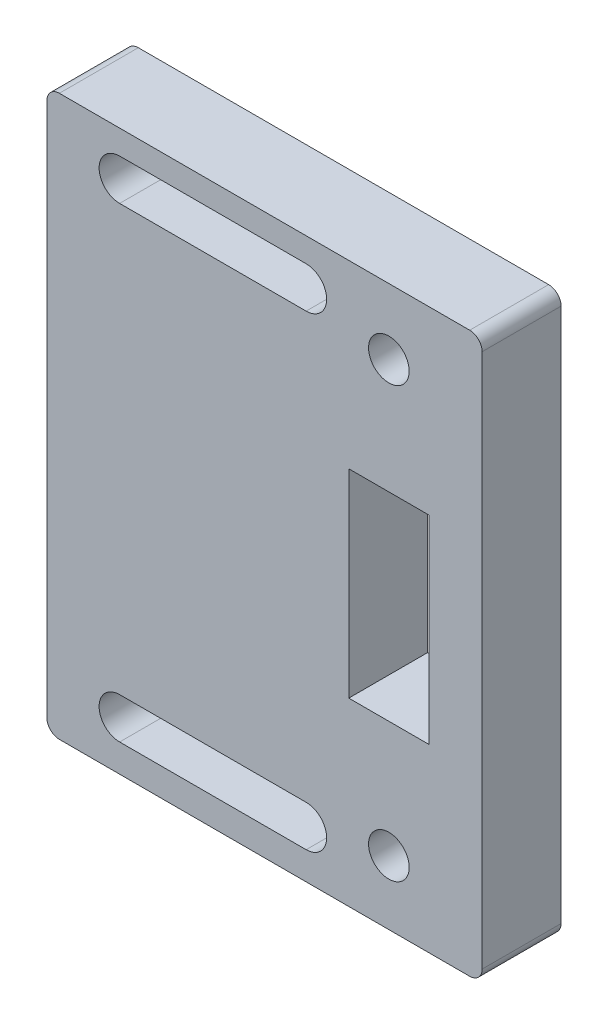
ISO-10303-21;
HEADER;
FILE_DESCRIPTION(('STEP AP214'),'2;1');
FILE_NAME('part.step','',(''),(''),'','','');
FILE_SCHEMA(('AUTOMOTIVE_DESIGN { 1 0 10303 214 1 1 1 1 }'));
ENDSEC;
DATA;
#1=APPLICATION_CONTEXT('core data for automotive mechanical design processes');
#2=APPLICATION_PROTOCOL_DEFINITION('international standard','automotive_design',2000,#1);
#3=PRODUCT_CONTEXT('',#1,'mechanical');
#4=PRODUCT('Part','Part','',(#3));
#5=PRODUCT_RELATED_PRODUCT_CATEGORY('part','',(#4));
#6=PRODUCT_DEFINITION_FORMATION('','',#4);
#7=PRODUCT_DEFINITION_CONTEXT('part definition',#1,'design');
#8=PRODUCT_DEFINITION('design','',#6,#7);
#9=PRODUCT_DEFINITION_SHAPE('','',#8);
#10=(LENGTH_UNIT() NAMED_UNIT(*) SI_UNIT(.MILLI.,.METRE.));
#11=(NAMED_UNIT(*) PLANE_ANGLE_UNIT() SI_UNIT($,.RADIAN.));
#12=(NAMED_UNIT(*) SI_UNIT($,.STERADIAN.) SOLID_ANGLE_UNIT());
#13=UNCERTAINTY_MEASURE_WITH_UNIT(LENGTH_MEASURE(1.E-05),#10,'distance_accuracy_value','');
#14=(GEOMETRIC_REPRESENTATION_CONTEXT(3) GLOBAL_UNCERTAINTY_ASSIGNED_CONTEXT((#13)) GLOBAL_UNIT_ASSIGNED_CONTEXT((#10,
#11,#12)) REPRESENTATION_CONTEXT('',''));
#15=CARTESIAN_POINT('',(0.,0.,0.));
#16=DIRECTION('',(0.,0.,1.));
#17=DIRECTION('',(1.,0.,0.));
#18=AXIS2_PLACEMENT_3D('',#15,#16,#17);
#19=CARTESIAN_POINT('',(0.,0.,12.7));
#20=DIRECTION('',(0.,0.,1.));
#21=DIRECTION('',(1.,0.,0.));
#22=AXIS2_PLACEMENT_3D('',#19,#20,#21);
#23=PLANE('',#22);
#24=DIRECTION('',(1.,0.,0.));
#25=VECTOR('',#24,1.);
#26=CARTESIAN_POINT('',(11.6955278418537,-78.9133841190442,12.7));
#27=LINE('',#26,#25);
#28=CARTESIAN_POINT('',(11.6955278418537,-78.9133841190442,12.7));
#29=VERTEX_POINT('',#28);
#30=CARTESIAN_POINT('',(41.6955278418537,-78.9133841190441,12.7));
#31=VERTEX_POINT('',#30);
#32=EDGE_CURVE('E182',#29,#31,#27,.T.);
#33=ORIENTED_EDGE('',*,*,#32,.T.);
#34=CARTESIAN_POINT('',(41.6955278418537,-82.2133841190441,12.7));
#35=DIRECTION('',(0.,0.,-1.));
#36=DIRECTION('',(-1.,0.,0.));
#37=AXIS2_PLACEMENT_3D('',#34,#35,#36);
#38=CIRCLE('',#37,3.3);
#39=CARTESIAN_POINT('',(41.6955278418537,-85.5133841190441,12.7));
#40=VERTEX_POINT('',#39);
#41=EDGE_CURVE('E194',#31,#40,#38,.T.);
#42=ORIENTED_EDGE('',*,*,#41,.T.);
#43=DIRECTION('',(-1.,0.,0.));
#44=VECTOR('',#43,1.);
#45=CARTESIAN_POINT('',(41.6955278418537,-85.5133841190441,12.7));
#46=LINE('',#45,#44);
#47=CARTESIAN_POINT('',(11.6955278418537,-85.5133841190441,12.7));
#48=VERTEX_POINT('',#47);
#49=EDGE_CURVE('E55',#40,#48,#46,.T.);
#50=ORIENTED_EDGE('',*,*,#49,.T.);
#51=CARTESIAN_POINT('',(11.6955278418537,-82.2133841190442,12.7));
#52=DIRECTION('',(0.,0.,-1.));
#53=DIRECTION('',(-1.,0.,0.));
#54=AXIS2_PLACEMENT_3D('',#51,#52,#53);
#55=CIRCLE('',#54,3.29999999999998);
#56=EDGE_CURVE('E191',#48,#29,#55,.T.);
#57=ORIENTED_EDGE('',*,*,#56,.T.);
#58=EDGE_LOOP('',(#33,#42,#50,#57));
#59=FACE_BOUND('',#58,.T.);
#60=DIRECTION('',(1.,0.,0.));
#61=VECTOR('',#60,1.);
#62=CARTESIAN_POINT('',(11.6955278418537,-3.89338411904414,12.7));
#63=LINE('',#62,#61);
#64=CARTESIAN_POINT('',(11.6955278418537,-3.89338411904414,12.7));
#65=VERTEX_POINT('',#64);
#66=CARTESIAN_POINT('',(41.6955278418537,-3.89338411904415,12.7));
#67=VERTEX_POINT('',#66);
#68=EDGE_CURVE('E249',#65,#67,#63,.T.);
#69=ORIENTED_EDGE('',*,*,#68,.T.);
#70=CARTESIAN_POINT('',(41.6955278418537,-7.19338411904415,12.7));
#71=DIRECTION('',(0.,0.,-1.));
#72=DIRECTION('',(-1.,0.,0.));
#73=AXIS2_PLACEMENT_3D('',#70,#71,#72);
#74=CIRCLE('',#73,3.3);
#75=CARTESIAN_POINT('',(41.6955278418537,-10.4933841190441,12.7));
#76=VERTEX_POINT('',#75);
#77=EDGE_CURVE('E264',#67,#76,#74,.T.);
#78=ORIENTED_EDGE('',*,*,#77,.T.);
#79=DIRECTION('',(1.,0.,0.));
#80=VECTOR('',#79,1.);
#81=CARTESIAN_POINT('',(11.6955278418537,-10.4933841190441,12.7));
#82=LINE('',#81,#80);
#83=CARTESIAN_POINT('',(11.6955278418537,-10.4933841190441,12.7));
#84=VERTEX_POINT('',#83);
#85=EDGE_CURVE('E261',#84,#76,#82,.T.);
#86=ORIENTED_EDGE('',*,*,#85,.F.);
#87=CARTESIAN_POINT('',(11.6955278418537,-7.19338411904414,12.7));
#88=DIRECTION('',(0.,0.,-1.));
#89=DIRECTION('',(-1.,0.,0.));
#90=AXIS2_PLACEMENT_3D('',#87,#88,#89);
#91=CIRCLE('',#90,3.3);
#92=EDGE_CURVE('E235',#84,#65,#91,.T.);
#93=ORIENTED_EDGE('',*,*,#92,.T.);
#94=EDGE_LOOP('',(#69,#78,#86,#93));
#95=FACE_BOUND('',#94,.T.);
#96=CARTESIAN_POINT('',(55.,-10.5796100233312,12.7));
#97=DIRECTION('',(0.,0.,-1.));
#98=DIRECTION('',(-1.,0.,0.));
#99=AXIS2_PLACEMENT_3D('',#96,#97,#98);
#100=CIRCLE('',#99,3.2639);
#101=CARTESIAN_POINT('',(51.7361,-10.5796100233312,12.7));
#102=VERTEX_POINT('',#101);
#103=EDGE_CURVE('E278',#102,#102,#100,.T.);
#104=ORIENTED_EDGE('',*,*,#103,.T.);
#105=EDGE_LOOP('',(#104));
#106=FACE_BOUND('',#105,.T.);
#107=CARTESIAN_POINT('',(55.,-79.6996100233311,12.7));
#108=DIRECTION('',(0.,0.,-1.));
#109=DIRECTION('',(-1.,0.,0.));
#110=AXIS2_PLACEMENT_3D('',#107,#108,#109);
#111=CIRCLE('',#110,3.2639);
#112=CARTESIAN_POINT('',(51.7361,-79.6996100233311,12.7));
#113=VERTEX_POINT('',#112);
#114=EDGE_CURVE('E290',#113,#113,#111,.T.);
#115=ORIENTED_EDGE('',*,*,#114,.T.);
#116=EDGE_LOOP('',(#115));
#117=FACE_BOUND('',#116,.T.);
#118=DIRECTION('',(-1.,0.,0.));
#119=VECTOR('',#118,1.);
#120=CARTESIAN_POINT('',(0.,0.,12.7));
#121=LINE('',#120,#119);
#122=CARTESIAN_POINT('',(68.,0.,12.7));
#123=VERTEX_POINT('',#122);
#124=CARTESIAN_POINT('',(2.,0.,12.7));
#125=VERTEX_POINT('',#124);
#126=EDGE_CURVE('E350',#123,#125,#121,.T.);
#127=ORIENTED_EDGE('',*,*,#126,.T.);
#128=CARTESIAN_POINT('',(2.,-2.,12.7));
#129=DIRECTION('',(0.,0.,1.));
#130=DIRECTION('',(1.,0.,0.));
#131=AXIS2_PLACEMENT_3D('',#128,#129,#130);
#132=CIRCLE('',#131,2.);
#133=CARTESIAN_POINT('',(0.,-2.,12.7));
#134=VERTEX_POINT('',#133);
#135=EDGE_CURVE('E403',#125,#134,#132,.T.);
#136=ORIENTED_EDGE('',*,*,#135,.T.);
#137=DIRECTION('',(0.,-1.,0.));
#138=VECTOR('',#137,1.);
#139=CARTESIAN_POINT('',(0.,0.,12.7));
#140=LINE('',#139,#138);
#141=CARTESIAN_POINT('',(0.,-88.,12.7));
#142=VERTEX_POINT('',#141);
#143=EDGE_CURVE('E337',#134,#142,#140,.T.);
#144=ORIENTED_EDGE('',*,*,#143,.T.);
#145=CARTESIAN_POINT('',(2.,-88.,12.7));
#146=DIRECTION('',(0.,0.,1.));
#147=DIRECTION('',(1.,0.,0.));
#148=AXIS2_PLACEMENT_3D('',#145,#146,#147);
#149=CIRCLE('',#148,2.);
#150=CARTESIAN_POINT('',(2.,-90.,12.7));
#151=VERTEX_POINT('',#150);
#152=EDGE_CURVE('E397',#142,#151,#149,.T.);
#153=ORIENTED_EDGE('',*,*,#152,.T.);
#154=DIRECTION('',(1.,0.,0.));
#155=VECTOR('',#154,1.);
#156=CARTESIAN_POINT('',(0.,-90.,12.7));
#157=LINE('',#156,#155);
#158=CARTESIAN_POINT('',(68.,-90.,12.7));
#159=VERTEX_POINT('',#158);
#160=EDGE_CURVE('E341',#151,#159,#157,.T.);
#161=ORIENTED_EDGE('',*,*,#160,.T.);
#162=CARTESIAN_POINT('',(68.,-88.,12.7));
#163=DIRECTION('',(0.,0.,1.));
#164=DIRECTION('',(1.,0.,0.));
#165=AXIS2_PLACEMENT_3D('',#162,#163,#164);
#166=CIRCLE('',#165,2.);
#167=CARTESIAN_POINT('',(70.,-88.,12.7));
#168=VERTEX_POINT('',#167);
#169=EDGE_CURVE('E394',#159,#168,#166,.T.);
#170=ORIENTED_EDGE('',*,*,#169,.T.);
#171=DIRECTION('',(0.,1.,0.));
#172=VECTOR('',#171,1.);
#173=CARTESIAN_POINT('',(70.,0.,12.7));
#174=LINE('',#173,#172);
#175=CARTESIAN_POINT('',(70.,-2.,12.7));
#176=VERTEX_POINT('',#175);
#177=EDGE_CURVE('E346',#168,#176,#174,.T.);
#178=ORIENTED_EDGE('',*,*,#177,.T.);
#179=CARTESIAN_POINT('',(68.,-2.,12.7));
#180=DIRECTION('',(0.,0.,1.));
#181=DIRECTION('',(1.,0.,0.));
#182=AXIS2_PLACEMENT_3D('',#179,#180,#181);
#183=CIRCLE('',#182,2.);
#184=EDGE_CURVE('E400',#176,#123,#183,.T.);
#185=ORIENTED_EDGE('',*,*,#184,.T.);
#186=EDGE_LOOP('',(#127,#136,#144,#153,#161,#170,#178,#185));
#187=FACE_BOUND('',#186,.T.);
#188=DIRECTION('',(1.,0.,0.));
#189=VECTOR('',#188,1.);
#190=CARTESIAN_POINT('',(55.,-60.975,12.7));
#191=LINE('',#190,#189);
#192=CARTESIAN_POINT('',(48.55,-60.975,12.7));
#193=VERTEX_POINT('',#192);
#194=CARTESIAN_POINT('',(61.45,-60.975,12.7));
#195=VERTEX_POINT('',#194);
#196=EDGE_CURVE('E302',#193,#195,#191,.T.);
#197=ORIENTED_EDGE('',*,*,#196,.F.);
#198=DIRECTION('',(0.,-1.,0.));
#199=VECTOR('',#198,1.);
#200=CARTESIAN_POINT('',(48.55,-60.975,12.7));
#201=LINE('',#200,#199);
#202=CARTESIAN_POINT('',(48.55,-29.025,12.7));
#203=VERTEX_POINT('',#202);
#204=EDGE_CURVE('E298',#203,#193,#201,.T.);
#205=ORIENTED_EDGE('',*,*,#204,.F.);
#206=DIRECTION('',(-1.,0.,0.));
#207=VECTOR('',#206,1.);
#208=CARTESIAN_POINT('',(48.55,-29.025,12.7));
#209=LINE('',#208,#207);
#210=CARTESIAN_POINT('',(61.45,-29.025,12.7));
#211=VERTEX_POINT('',#210);
#212=EDGE_CURVE('E295',#211,#203,#209,.T.);
#213=ORIENTED_EDGE('',*,*,#212,.F.);
#214=DIRECTION('',(0.,1.,0.));
#215=VECTOR('',#214,1.);
#216=CARTESIAN_POINT('',(61.45,-29.025,12.7));
#217=LINE('',#216,#215);
#218=EDGE_CURVE('E305',#195,#211,#217,.T.);
#219=ORIENTED_EDGE('',*,*,#218,.F.);
#220=EDGE_LOOP('',(#197,#205,#213,#219));
#221=FACE_BOUND('',#220,.T.);
#222=ADVANCED_FACE('F39',(#59,#95,#106,#117,#187,#221),#23,.T.);
#223=CARTESIAN_POINT('',(0.,0.,0.));
#224=DIRECTION('',(0.,0.,1.));
#225=DIRECTION('',(1.,0.,0.));
#226=AXIS2_PLACEMENT_3D('',#223,#224,#225);
#227=PLANE('',#226);
#228=CARTESIAN_POINT('',(41.6955278418537,-82.2133841190441,0.));
#229=DIRECTION('',(0.,0.,-1.));
#230=DIRECTION('',(-1.,0.,0.));
#231=AXIS2_PLACEMENT_3D('',#228,#229,#230);
#232=CIRCLE('',#231,3.3);
#233=CARTESIAN_POINT('',(41.6955278418537,-78.9133841190441,0.));
#234=VERTEX_POINT('',#233);
#235=CARTESIAN_POINT('',(41.6955278418537,-85.5133841190441,0.));
#236=VERTEX_POINT('',#235);
#237=EDGE_CURVE('E215',#234,#236,#232,.T.);
#238=ORIENTED_EDGE('',*,*,#237,.F.);
#239=DIRECTION('',(1.,0.,0.));
#240=VECTOR('',#239,1.);
#241=CARTESIAN_POINT('',(11.6955278418537,-78.9133841190442,0.));
#242=LINE('',#241,#240);
#243=CARTESIAN_POINT('',(11.6955278418537,-78.9133841190442,0.));
#244=VERTEX_POINT('',#243);
#245=EDGE_CURVE('E185',#244,#234,#242,.T.);
#246=ORIENTED_EDGE('',*,*,#245,.F.);
#247=CARTESIAN_POINT('',(11.6955278418537,-82.2133841190442,0.));
#248=DIRECTION('',(0.,0.,-1.));
#249=DIRECTION('',(-1.,0.,0.));
#250=AXIS2_PLACEMENT_3D('',#247,#248,#249);
#251=CIRCLE('',#250,3.29999999999998);
#252=CARTESIAN_POINT('',(11.6955278418537,-85.5133841190441,0.));
#253=VERTEX_POINT('',#252);
#254=EDGE_CURVE('E202',#253,#244,#251,.T.);
#255=ORIENTED_EDGE('',*,*,#254,.F.);
#256=DIRECTION('',(-1.,0.,0.));
#257=VECTOR('',#256,1.);
#258=CARTESIAN_POINT('',(41.6955278418537,-85.5133841190441,0.));
#259=LINE('',#258,#257);
#260=EDGE_CURVE('E206',#236,#253,#259,.T.);
#261=ORIENTED_EDGE('',*,*,#260,.F.);
#262=EDGE_LOOP('',(#238,#246,#255,#261));
#263=FACE_BOUND('',#262,.T.);
#264=CARTESIAN_POINT('',(41.6955278418537,-7.19338411904415,0.));
#265=DIRECTION('',(0.,0.,-1.));
#266=DIRECTION('',(-1.,0.,0.));
#267=AXIS2_PLACEMENT_3D('',#264,#265,#266);
#268=CIRCLE('',#267,3.3);
#269=CARTESIAN_POINT('',(41.6955278418537,-3.89338411904415,0.));
#270=VERTEX_POINT('',#269);
#271=CARTESIAN_POINT('',(41.6955278418537,-10.4933841190441,0.));
#272=VERTEX_POINT('',#271);
#273=EDGE_CURVE('E253',#270,#272,#268,.T.);
#274=ORIENTED_EDGE('',*,*,#273,.F.);
#275=DIRECTION('',(1.,0.,0.));
#276=VECTOR('',#275,1.);
#277=CARTESIAN_POINT('',(11.6955278418537,-3.89338411904414,0.));
#278=LINE('',#277,#276);
#279=CARTESIAN_POINT('',(11.6955278418537,-3.89338411904414,0.));
#280=VERTEX_POINT('',#279);
#281=EDGE_CURVE('E216',#280,#270,#278,.T.);
#282=ORIENTED_EDGE('',*,*,#281,.F.);
#283=CARTESIAN_POINT('',(11.6955278418537,-7.19338411904414,0.));
#284=DIRECTION('',(0.,0.,-1.));
#285=DIRECTION('',(-1.,0.,0.));
#286=AXIS2_PLACEMENT_3D('',#283,#284,#285);
#287=CIRCLE('',#286,3.3);
#288=CARTESIAN_POINT('',(11.6955278418537,-10.4933841190441,0.));
#289=VERTEX_POINT('',#288);
#290=EDGE_CURVE('E244',#289,#280,#287,.T.);
#291=ORIENTED_EDGE('',*,*,#290,.F.);
#292=DIRECTION('',(1.,0.,0.));
#293=VECTOR('',#292,1.);
#294=CARTESIAN_POINT('',(11.6955278418537,-10.4933841190441,0.));
#295=LINE('',#294,#293);
#296=EDGE_CURVE('E248',#289,#272,#295,.T.);
#297=ORIENTED_EDGE('',*,*,#296,.T.);
#298=EDGE_LOOP('',(#274,#282,#291,#297));
#299=FACE_BOUND('',#298,.T.);
#300=CARTESIAN_POINT('',(55.,-10.5796100233312,0.));
#301=DIRECTION('',(0.,0.,-1.));
#302=DIRECTION('',(-1.,0.,0.));
#303=AXIS2_PLACEMENT_3D('',#300,#301,#302);
#304=CIRCLE('',#303,6.4389);
#305=CARTESIAN_POINT('',(48.5611,-10.5796100233312,0.));
#306=VERTEX_POINT('',#305);
#307=EDGE_CURVE('E225',#306,#306,#304,.T.);
#308=ORIENTED_EDGE('',*,*,#307,.F.);
#309=EDGE_LOOP('',(#308));
#310=FACE_BOUND('',#309,.T.);
#311=CARTESIAN_POINT('',(55.,-79.6996100233311,0.));
#312=DIRECTION('',(0.,0.,-1.));
#313=DIRECTION('',(-1.,0.,0.));
#314=AXIS2_PLACEMENT_3D('',#311,#312,#313);
#315=CIRCLE('',#314,6.4389);
#316=CARTESIAN_POINT('',(48.5611,-79.6996100233311,0.));
#317=VERTEX_POINT('',#316);
#318=EDGE_CURVE('E282',#317,#317,#315,.T.);
#319=ORIENTED_EDGE('',*,*,#318,.F.);
#320=EDGE_LOOP('',(#319));
#321=FACE_BOUND('',#320,.T.);
#322=DIRECTION('',(0.,-1.,0.));
#323=VECTOR('',#322,1.);
#324=CARTESIAN_POINT('',(0.,0.,0.));
#325=LINE('',#324,#323);
#326=CARTESIAN_POINT('',(0.,-2.,0.));
#327=VERTEX_POINT('',#326);
#328=CARTESIAN_POINT('',(0.,-88.,0.));
#329=VERTEX_POINT('',#328);
#330=EDGE_CURVE('E336',#327,#329,#325,.T.);
#331=ORIENTED_EDGE('',*,*,#330,.F.);
#332=CARTESIAN_POINT('',(2.,-2.,0.));
#333=DIRECTION('',(0.,0.,1.));
#334=DIRECTION('',(1.,0.,0.));
#335=AXIS2_PLACEMENT_3D('',#332,#333,#334);
#336=CIRCLE('',#335,2.);
#337=CARTESIAN_POINT('',(2.,0.,0.));
#338=VERTEX_POINT('',#337);
#339=EDGE_CURVE('E384',#327,#338,#336,.F.);
#340=ORIENTED_EDGE('',*,*,#339,.T.);
#341=DIRECTION('',(-1.,0.,0.));
#342=VECTOR('',#341,1.);
#343=CARTESIAN_POINT('',(0.,0.,0.));
#344=LINE('',#343,#342);
#345=CARTESIAN_POINT('',(68.,0.,0.));
#346=VERTEX_POINT('',#345);
#347=EDGE_CURVE('E342',#346,#338,#344,.T.);
#348=ORIENTED_EDGE('',*,*,#347,.F.);
#349=CARTESIAN_POINT('',(68.,-2.,0.));
#350=DIRECTION('',(0.,0.,1.));
#351=DIRECTION('',(1.,0.,0.));
#352=AXIS2_PLACEMENT_3D('',#349,#350,#351);
#353=CIRCLE('',#352,2.);
#354=CARTESIAN_POINT('',(70.,-2.,0.));
#355=VERTEX_POINT('',#354);
#356=EDGE_CURVE('E381',#346,#355,#353,.F.);
#357=ORIENTED_EDGE('',*,*,#356,.T.);
#358=DIRECTION('',(0.,1.,0.));
#359=VECTOR('',#358,1.);
#360=CARTESIAN_POINT('',(70.,0.,0.));
#361=LINE('',#360,#359);
#362=CARTESIAN_POINT('',(70.,-88.,0.));
#363=VERTEX_POINT('',#362);
#364=EDGE_CURVE('E362',#363,#355,#361,.T.);
#365=ORIENTED_EDGE('',*,*,#364,.F.);
#366=CARTESIAN_POINT('',(68.,-88.,0.));
#367=DIRECTION('',(0.,0.,1.));
#368=DIRECTION('',(1.,0.,0.));
#369=AXIS2_PLACEMENT_3D('',#366,#367,#368);
#370=CIRCLE('',#369,2.);
#371=CARTESIAN_POINT('',(68.,-90.,0.));
#372=VERTEX_POINT('',#371);
#373=EDGE_CURVE('E375',#363,#372,#370,.F.);
#374=ORIENTED_EDGE('',*,*,#373,.T.);
#375=DIRECTION('',(1.,0.,0.));
#376=VECTOR('',#375,1.);
#377=CARTESIAN_POINT('',(0.,-90.,0.));
#378=LINE('',#377,#376);
#379=CARTESIAN_POINT('',(2.,-90.,0.));
#380=VERTEX_POINT('',#379);
#381=EDGE_CURVE('E358',#380,#372,#378,.T.);
#382=ORIENTED_EDGE('',*,*,#381,.F.);
#383=CARTESIAN_POINT('',(2.,-88.,0.));
#384=DIRECTION('',(0.,0.,1.));
#385=DIRECTION('',(1.,0.,0.));
#386=AXIS2_PLACEMENT_3D('',#383,#384,#385);
#387=CIRCLE('',#386,2.);
#388=EDGE_CURVE('E378',#380,#329,#387,.F.);
#389=ORIENTED_EDGE('',*,*,#388,.T.);
#390=EDGE_LOOP('',(#331,#340,#348,#357,#365,#374,#382,#389));
#391=FACE_BOUND('',#390,.T.);
#392=DIRECTION('',(0.,-1.,0.));
#393=VECTOR('',#392,1.);
#394=CARTESIAN_POINT('',(48.55,-60.975,0.));
#395=LINE('',#394,#393);
#396=CARTESIAN_POINT('',(48.55,-29.025,0.));
#397=VERTEX_POINT('',#396);
#398=CARTESIAN_POINT('',(48.55,-60.975,0.));
#399=VERTEX_POINT('',#398);
#400=EDGE_CURVE('E294',#397,#399,#395,.T.);
#401=ORIENTED_EDGE('',*,*,#400,.T.);
#402=DIRECTION('',(1.,0.,0.));
#403=VECTOR('',#402,1.);
#404=CARTESIAN_POINT('',(61.45,-60.975,0.));
#405=LINE('',#404,#403);
#406=CARTESIAN_POINT('',(61.45,-60.975,0.));
#407=VERTEX_POINT('',#406);
#408=EDGE_CURVE('E313',#399,#407,#405,.T.);
#409=ORIENTED_EDGE('',*,*,#408,.T.);
#410=DIRECTION('',(0.,1.,0.));
#411=VECTOR('',#410,1.);
#412=CARTESIAN_POINT('',(61.45,-29.025,0.));
#413=LINE('',#412,#411);
#414=CARTESIAN_POINT('',(61.45,-29.025,0.));
#415=VERTEX_POINT('',#414);
#416=EDGE_CURVE('E317',#407,#415,#413,.T.);
#417=ORIENTED_EDGE('',*,*,#416,.T.);
#418=DIRECTION('',(-1.,0.,0.));
#419=VECTOR('',#418,1.);
#420=CARTESIAN_POINT('',(55.,-29.025,0.));
#421=LINE('',#420,#419);
#422=EDGE_CURVE('E299',#415,#397,#421,.T.);
#423=ORIENTED_EDGE('',*,*,#422,.T.);
#424=EDGE_LOOP('',(#401,#409,#417,#423));
#425=FACE_BOUND('',#424,.T.);
#426=ADVANCED_FACE('F432',(#263,#299,#310,#321,#391,#425),#227,.F.);
#427=CARTESIAN_POINT('',(0.,0.,12.7));
#428=DIRECTION('',(1.,0.,0.));
#429=DIRECTION('',(0.,0.,-1.));
#430=AXIS2_PLACEMENT_3D('',#427,#428,#429);
#431=PLANE('',#430);
#432=ORIENTED_EDGE('',*,*,#143,.F.);
#433=DIRECTION('',(0.,0.,-1.));
#434=VECTOR('',#433,1.);
#435=CARTESIAN_POINT('',(0.,-2.,12.7));
#436=LINE('',#435,#434);
#437=EDGE_CURVE('E371',#134,#327,#436,.T.);
#438=ORIENTED_EDGE('',*,*,#437,.T.);
#439=ORIENTED_EDGE('',*,*,#330,.T.);
#440=DIRECTION('',(0.,0.,-1.));
#441=VECTOR('',#440,1.);
#442=CARTESIAN_POINT('',(0.,-88.,12.7));
#443=LINE('',#442,#441);
#444=EDGE_CURVE('E354',#329,#142,#443,.F.);
#445=ORIENTED_EDGE('',*,*,#444,.T.);
#446=EDGE_LOOP('',(#432,#438,#439,#445));
#447=FACE_BOUND('',#446,.T.);
#448=ADVANCED_FACE('F449',(#447),#431,.F.);
#449=CARTESIAN_POINT('',(0.,-90.,12.7));
#450=DIRECTION('',(0.,1.,0.));
#451=DIRECTION('',(-1.,0.,0.));
#452=AXIS2_PLACEMENT_3D('',#449,#450,#451);
#453=PLANE('',#452);
#454=ORIENTED_EDGE('',*,*,#160,.F.);
#455=DIRECTION('',(0.,0.,-1.));
#456=VECTOR('',#455,1.);
#457=CARTESIAN_POINT('',(2.,-90.,12.7));
#458=LINE('',#457,#456);
#459=EDGE_CURVE('E11',#151,#380,#458,.T.);
#460=ORIENTED_EDGE('',*,*,#459,.T.);
#461=ORIENTED_EDGE('',*,*,#381,.T.);
#462=DIRECTION('',(0.,0.,-1.));
#463=VECTOR('',#462,1.);
#464=CARTESIAN_POINT('',(68.,-90.,12.7));
#465=LINE('',#464,#463);
#466=EDGE_CURVE('E48',#372,#159,#465,.F.);
#467=ORIENTED_EDGE('',*,*,#466,.T.);
#468=EDGE_LOOP('',(#454,#460,#461,#467));
#469=FACE_BOUND('',#468,.T.);
#470=ADVANCED_FACE('F416',(#469),#453,.F.);
#471=CARTESIAN_POINT('',(70.,0.,12.7));
#472=DIRECTION('',(-1.,0.,0.));
#473=DIRECTION('',(0.,-1.,0.));
#474=AXIS2_PLACEMENT_3D('',#471,#472,#473);
#475=PLANE('',#474);
#476=ORIENTED_EDGE('',*,*,#364,.T.);
#477=DIRECTION('',(0.,0.,-1.));
#478=VECTOR('',#477,1.);
#479=CARTESIAN_POINT('',(70.,-2.,12.7));
#480=LINE('',#479,#478);
#481=EDGE_CURVE('E410',#355,#176,#480,.F.);
#482=ORIENTED_EDGE('',*,*,#481,.T.);
#483=ORIENTED_EDGE('',*,*,#177,.F.);
#484=DIRECTION('',(0.,0.,-1.));
#485=VECTOR('',#484,1.);
#486=CARTESIAN_POINT('',(70.,-88.,12.7));
#487=LINE('',#486,#485);
#488=EDGE_CURVE('E406',#168,#363,#487,.T.);
#489=ORIENTED_EDGE('',*,*,#488,.T.);
#490=EDGE_LOOP('',(#476,#482,#483,#489));
#491=FACE_BOUND('',#490,.T.);
#492=ADVANCED_FACE('F428',(#491),#475,.F.);
#493=CARTESIAN_POINT('',(0.,0.,12.7));
#494=DIRECTION('',(0.,-1.,0.));
#495=DIRECTION('',(0.,0.,-1.));
#496=AXIS2_PLACEMENT_3D('',#493,#494,#495);
#497=PLANE('',#496);
#498=ORIENTED_EDGE('',*,*,#347,.T.);
#499=DIRECTION('',(0.,0.,-1.));
#500=VECTOR('',#499,1.);
#501=CARTESIAN_POINT('',(2.,0.,12.7));
#502=LINE('',#501,#500);
#503=EDGE_CURVE('E391',#338,#125,#502,.F.);
#504=ORIENTED_EDGE('',*,*,#503,.T.);
#505=ORIENTED_EDGE('',*,*,#126,.F.);
#506=DIRECTION('',(0.,0.,-1.));
#507=VECTOR('',#506,1.);
#508=CARTESIAN_POINT('',(68.,0.,12.7));
#509=LINE('',#508,#507);
#510=EDGE_CURVE('E387',#123,#346,#509,.T.);
#511=ORIENTED_EDGE('',*,*,#510,.T.);
#512=EDGE_LOOP('',(#498,#504,#505,#511));
#513=FACE_BOUND('',#512,.T.);
#514=ADVANCED_FACE('F441',(#513),#497,.F.);
#515=CARTESIAN_POINT('',(48.55,-60.975,12.7));
#516=DIRECTION('',(1.,0.,0.));
#517=DIRECTION('',(0.,0.,-1.));
#518=AXIS2_PLACEMENT_3D('',#515,#516,#517);
#519=PLANE('',#518);
#520=ORIENTED_EDGE('',*,*,#400,.F.);
#521=DIRECTION('',(0.,0.,-1.));
#522=VECTOR('',#521,1.);
#523=CARTESIAN_POINT('',(48.55,-29.025,12.7));
#524=LINE('',#523,#522);
#525=EDGE_CURVE('E333',#203,#397,#524,.T.);
#526=ORIENTED_EDGE('',*,*,#525,.F.);
#527=ORIENTED_EDGE('',*,*,#204,.T.);
#528=DIRECTION('',(0.,0.,-1.));
#529=VECTOR('',#528,1.);
#530=CARTESIAN_POINT('',(48.55,-60.975,12.7));
#531=LINE('',#530,#529);
#532=EDGE_CURVE('E329',#193,#399,#531,.T.);
#533=ORIENTED_EDGE('',*,*,#532,.T.);
#534=EDGE_LOOP('',(#520,#526,#527,#533));
#535=FACE_BOUND('',#534,.T.);
#536=ADVANCED_FACE('F468',(#535),#519,.T.);
#537=CARTESIAN_POINT('',(61.45,-60.975,12.7));
#538=DIRECTION('',(0.,1.,0.));
#539=DIRECTION('',(-1.,0.,0.));
#540=AXIS2_PLACEMENT_3D('',#537,#538,#539);
#541=PLANE('',#540);
#542=ORIENTED_EDGE('',*,*,#408,.F.);
#543=ORIENTED_EDGE('',*,*,#532,.F.);
#544=ORIENTED_EDGE('',*,*,#196,.T.);
#545=DIRECTION('',(0.,0.,-1.));
#546=VECTOR('',#545,1.);
#547=CARTESIAN_POINT('',(61.45,-60.975,12.7));
#548=LINE('',#547,#546);
#549=EDGE_CURVE('E326',#195,#407,#548,.T.);
#550=ORIENTED_EDGE('',*,*,#549,.T.);
#551=EDGE_LOOP('',(#542,#543,#544,#550));
#552=FACE_BOUND('',#551,.T.);
#553=ADVANCED_FACE('F512',(#552),#541,.T.);
#554=CARTESIAN_POINT('',(61.45,-29.025,12.7));
#555=DIRECTION('',(-1.,0.,0.));
#556=DIRECTION('',(0.,-1.,0.));
#557=AXIS2_PLACEMENT_3D('',#554,#555,#556);
#558=PLANE('',#557);
#559=ORIENTED_EDGE('',*,*,#416,.F.);
#560=ORIENTED_EDGE('',*,*,#549,.F.);
#561=ORIENTED_EDGE('',*,*,#218,.T.);
#562=DIRECTION('',(0.,0.,-1.));
#563=VECTOR('',#562,1.);
#564=CARTESIAN_POINT('',(61.45,-29.025,12.7));
#565=LINE('',#564,#563);
#566=EDGE_CURVE('E309',#211,#415,#565,.T.);
#567=ORIENTED_EDGE('',*,*,#566,.T.);
#568=EDGE_LOOP('',(#559,#560,#561,#567));
#569=FACE_BOUND('',#568,.T.);
#570=ADVANCED_FACE('F509',(#569),#558,.T.);
#571=CARTESIAN_POINT('',(55.,-29.025,12.7));
#572=DIRECTION('',(0.,-1.,0.));
#573=DIRECTION('',(0.,0.,-1.));
#574=AXIS2_PLACEMENT_3D('',#571,#572,#573);
#575=PLANE('',#574);
#576=ORIENTED_EDGE('',*,*,#422,.F.);
#577=ORIENTED_EDGE('',*,*,#566,.F.);
#578=ORIENTED_EDGE('',*,*,#212,.T.);
#579=ORIENTED_EDGE('',*,*,#525,.T.);
#580=EDGE_LOOP('',(#576,#577,#578,#579));
#581=FACE_BOUND('',#580,.T.);
#582=ADVANCED_FACE('F505',(#581),#575,.T.);
#583=CARTESIAN_POINT('',(55.,-79.6996100233311,0.));
#584=DIRECTION('',(0.,0.,-1.));
#585=DIRECTION('',(-1.,0.,0.));
#586=AXIS2_PLACEMENT_3D('',#583,#584,#585);
#587=CYLINDRICAL_SURFACE('',#586,3.26389999999999);
#588=ORIENTED_EDGE('',*,*,#114,.F.);
#589=EDGE_LOOP('',(#588));
#590=FACE_BOUND('',#589,.T.);
#591=CARTESIAN_POINT('',(55.,-79.6996100233311,3.65241969292671));
#592=DIRECTION('',(0.,0.,-1.));
#593=DIRECTION('',(-1.,0.,0.));
#594=AXIS2_PLACEMENT_3D('',#591,#592,#593);
#595=CIRCLE('',#594,3.26389999999999);
#596=CARTESIAN_POINT('',(51.7361,-79.6996100233311,3.65241969292671));
#597=VERTEX_POINT('',#596);
#598=EDGE_CURVE('E286',#597,#597,#595,.T.);
#599=ORIENTED_EDGE('',*,*,#598,.T.);
#600=EDGE_LOOP('',(#599));
#601=FACE_BOUND('',#600,.T.);
#602=ADVANCED_FACE('F501',(#590,#601),#587,.F.);
#603=CARTESIAN_POINT('',(55.,-79.6996100233311,0.));
#604=DIRECTION('',(0.,0.,-1.));
#605=DIRECTION('',(-1.,0.,0.));
#606=AXIS2_PLACEMENT_3D('',#603,#604,#605);
#607=CONICAL_SURFACE('',#606,6.4389,0.715584993317678);
#608=ORIENTED_EDGE('',*,*,#598,.F.);
#609=EDGE_LOOP('',(#608));
#610=FACE_BOUND('',#609,.T.);
#611=ORIENTED_EDGE('',*,*,#318,.T.);
#612=EDGE_LOOP('',(#611));
#613=FACE_BOUND('',#612,.T.);
#614=ADVANCED_FACE('F490',(#610,#613),#607,.F.);
#615=CARTESIAN_POINT('',(55.,-10.5796100233312,0.));
#616=DIRECTION('',(0.,0.,-1.));
#617=DIRECTION('',(-1.,0.,0.));
#618=AXIS2_PLACEMENT_3D('',#615,#616,#617);
#619=CYLINDRICAL_SURFACE('',#618,3.26389999999999);
#620=ORIENTED_EDGE('',*,*,#103,.F.);
#621=EDGE_LOOP('',(#620));
#622=FACE_BOUND('',#621,.T.);
#623=CARTESIAN_POINT('',(55.,-10.5796100233312,3.65241969292671));
#624=DIRECTION('',(0.,0.,-1.));
#625=DIRECTION('',(-1.,0.,0.));
#626=AXIS2_PLACEMENT_3D('',#623,#624,#625);
#627=CIRCLE('',#626,3.26389999999999);
#628=CARTESIAN_POINT('',(51.7361,-10.5796100233312,3.65241969292671));
#629=VERTEX_POINT('',#628);
#630=EDGE_CURVE('E274',#629,#629,#627,.T.);
#631=ORIENTED_EDGE('',*,*,#630,.T.);
#632=EDGE_LOOP('',(#631));
#633=FACE_BOUND('',#632,.T.);
#634=ADVANCED_FACE('F484',(#622,#633),#619,.F.);
#635=CARTESIAN_POINT('',(55.,-10.5796100233312,0.));
#636=DIRECTION('',(0.,0.,-1.));
#637=DIRECTION('',(-1.,0.,0.));
#638=AXIS2_PLACEMENT_3D('',#635,#636,#637);
#639=CONICAL_SURFACE('',#638,6.4389,0.715584993317678);
#640=ORIENTED_EDGE('',*,*,#630,.F.);
#641=EDGE_LOOP('',(#640));
#642=FACE_BOUND('',#641,.T.);
#643=ORIENTED_EDGE('',*,*,#307,.T.);
#644=EDGE_LOOP('',(#643));
#645=FACE_BOUND('',#644,.T.);
#646=ADVANCED_FACE('F480',(#642,#645),#639,.F.);
#647=CARTESIAN_POINT('',(2.,-2.,12.7));
#648=DIRECTION('',(0.,0.,-1.));
#649=DIRECTION('',(-1.,0.,0.));
#650=AXIS2_PLACEMENT_3D('',#647,#648,#649);
#651=CYLINDRICAL_SURFACE('',#650,2.);
#652=ORIENTED_EDGE('',*,*,#135,.F.);
#653=ORIENTED_EDGE('',*,*,#503,.F.);
#654=ORIENTED_EDGE('',*,*,#339,.F.);
#655=ORIENTED_EDGE('',*,*,#437,.F.);
#656=EDGE_LOOP('',(#652,#653,#654,#655));
#657=FACE_BOUND('',#656,.T.);
#658=ADVANCED_FACE('F447',(#657),#651,.T.);
#659=CARTESIAN_POINT('',(68.,-2.,12.7));
#660=DIRECTION('',(0.,0.,-1.));
#661=DIRECTION('',(-1.,0.,0.));
#662=AXIS2_PLACEMENT_3D('',#659,#660,#661);
#663=CYLINDRICAL_SURFACE('',#662,2.);
#664=ORIENTED_EDGE('',*,*,#184,.F.);
#665=ORIENTED_EDGE('',*,*,#481,.F.);
#666=ORIENTED_EDGE('',*,*,#356,.F.);
#667=ORIENTED_EDGE('',*,*,#510,.F.);
#668=EDGE_LOOP('',(#664,#665,#666,#667));
#669=FACE_BOUND('',#668,.T.);
#670=ADVANCED_FACE('F438',(#669),#663,.T.);
#671=CARTESIAN_POINT('',(2.,-88.,12.7));
#672=DIRECTION('',(0.,0.,-1.));
#673=DIRECTION('',(-1.,0.,0.));
#674=AXIS2_PLACEMENT_3D('',#671,#672,#673);
#675=CYLINDRICAL_SURFACE('',#674,2.);
#676=ORIENTED_EDGE('',*,*,#152,.F.);
#677=ORIENTED_EDGE('',*,*,#444,.F.);
#678=ORIENTED_EDGE('',*,*,#388,.F.);
#679=ORIENTED_EDGE('',*,*,#459,.F.);
#680=EDGE_LOOP('',(#676,#677,#678,#679));
#681=FACE_BOUND('',#680,.T.);
#682=ADVANCED_FACE('F452',(#681),#675,.T.);
#683=CARTESIAN_POINT('',(68.,-88.,12.7));
#684=DIRECTION('',(0.,0.,-1.));
#685=DIRECTION('',(-1.,0.,0.));
#686=AXIS2_PLACEMENT_3D('',#683,#684,#685);
#687=CYLINDRICAL_SURFACE('',#686,2.);
#688=ORIENTED_EDGE('',*,*,#169,.F.);
#689=ORIENTED_EDGE('',*,*,#466,.F.);
#690=ORIENTED_EDGE('',*,*,#373,.F.);
#691=ORIENTED_EDGE('',*,*,#488,.F.);
#692=EDGE_LOOP('',(#688,#689,#690,#691));
#693=FACE_BOUND('',#692,.T.);
#694=ADVANCED_FACE('F41',(#693),#687,.T.);
#695=CARTESIAN_POINT('',(11.6955278418537,-3.89338411904414,12.7));
#696=DIRECTION('',(0.,1.,0.));
#697=DIRECTION('',(-1.,0.,0.));
#698=AXIS2_PLACEMENT_3D('',#695,#696,#697);
#699=PLANE('',#698);
#700=ORIENTED_EDGE('',*,*,#281,.T.);
#701=DIRECTION('',(0.,0.,-1.));
#702=VECTOR('',#701,1.);
#703=CARTESIAN_POINT('',(41.6955278418537,-3.89338411904415,12.7));
#704=LINE('',#703,#702);
#705=EDGE_CURVE('E231',#67,#270,#704,.T.);
#706=ORIENTED_EDGE('',*,*,#705,.F.);
#707=ORIENTED_EDGE('',*,*,#68,.F.);
#708=DIRECTION('',(0.,0.,-1.));
#709=VECTOR('',#708,1.);
#710=CARTESIAN_POINT('',(11.6955278418537,-3.89338411904414,12.7));
#711=LINE('',#710,#709);
#712=EDGE_CURVE('E241',#65,#280,#711,.T.);
#713=ORIENTED_EDGE('',*,*,#712,.T.);
#714=EDGE_LOOP('',(#700,#706,#707,#713));
#715=FACE_BOUND('',#714,.T.);
#716=ADVANCED_FACE('F458',(#715),#699,.F.);
#717=CARTESIAN_POINT('',(11.6955278418537,-7.19338411904414,12.7));
#718=DIRECTION('',(0.,0.,-1.));
#719=DIRECTION('',(-1.,0.,0.));
#720=AXIS2_PLACEMENT_3D('',#717,#718,#719);
#721=CYLINDRICAL_SURFACE('',#720,3.3);
#722=ORIENTED_EDGE('',*,*,#290,.T.);
#723=ORIENTED_EDGE('',*,*,#712,.F.);
#724=ORIENTED_EDGE('',*,*,#92,.F.);
#725=DIRECTION('',(0.,0.,-1.));
#726=VECTOR('',#725,1.);
#727=CARTESIAN_POINT('',(11.6955278418537,-10.4933841190441,12.7));
#728=LINE('',#727,#726);
#729=EDGE_CURVE('E238',#84,#289,#728,.T.);
#730=ORIENTED_EDGE('',*,*,#729,.T.);
#731=EDGE_LOOP('',(#722,#723,#724,#730));
#732=FACE_BOUND('',#731,.T.);
#733=ADVANCED_FACE('F496',(#732),#721,.F.);
#734=CARTESIAN_POINT('',(11.6955278418537,-10.4933841190441,12.7));
#735=DIRECTION('',(0.,1.,0.));
#736=DIRECTION('',(0.,0.,1.));
#737=AXIS2_PLACEMENT_3D('',#734,#735,#736);
#738=PLANE('',#737);
#739=ORIENTED_EDGE('',*,*,#296,.F.);
#740=ORIENTED_EDGE('',*,*,#729,.F.);
#741=ORIENTED_EDGE('',*,*,#85,.T.);
#742=DIRECTION('',(0.,0.,-1.));
#743=VECTOR('',#742,1.);
#744=CARTESIAN_POINT('',(41.6955278418537,-10.4933841190441,12.7));
#745=LINE('',#744,#743);
#746=EDGE_CURVE('E63',#76,#272,#745,.T.);
#747=ORIENTED_EDGE('',*,*,#746,.T.);
#748=EDGE_LOOP('',(#739,#740,#741,#747));
#749=FACE_BOUND('',#748,.T.);
#750=ADVANCED_FACE('F574',(#749),#738,.T.);
#751=CARTESIAN_POINT('',(41.6955278418537,-7.19338411904415,12.7));
#752=DIRECTION('',(0.,0.,-1.));
#753=DIRECTION('',(-1.,0.,0.));
#754=AXIS2_PLACEMENT_3D('',#751,#752,#753);
#755=CYLINDRICAL_SURFACE('',#754,3.3);
#756=ORIENTED_EDGE('',*,*,#273,.T.);
#757=ORIENTED_EDGE('',*,*,#746,.F.);
#758=ORIENTED_EDGE('',*,*,#77,.F.);
#759=ORIENTED_EDGE('',*,*,#705,.T.);
#760=EDGE_LOOP('',(#756,#757,#758,#759));
#761=FACE_BOUND('',#760,.T.);
#762=ADVANCED_FACE('F583',(#761),#755,.F.);
#763=CARTESIAN_POINT('',(11.6955278418537,-78.9133841190442,12.7));
#764=DIRECTION('',(0.,1.,0.));
#765=DIRECTION('',(-1.,0.,0.));
#766=AXIS2_PLACEMENT_3D('',#763,#764,#765);
#767=PLANE('',#766);
#768=ORIENTED_EDGE('',*,*,#245,.T.);
#769=DIRECTION('',(0.,0.,-1.));
#770=VECTOR('',#769,1.);
#771=CARTESIAN_POINT('',(41.6955278418537,-78.9133841190441,12.7));
#772=LINE('',#771,#770);
#773=EDGE_CURVE('E178',#31,#234,#772,.T.);
#774=ORIENTED_EDGE('',*,*,#773,.F.);
#775=ORIENTED_EDGE('',*,*,#32,.F.);
#776=DIRECTION('',(0.,0.,-1.));
#777=VECTOR('',#776,1.);
#778=CARTESIAN_POINT('',(11.6955278418537,-78.9133841190442,12.7));
#779=LINE('',#778,#777);
#780=EDGE_CURVE('E222',#29,#244,#779,.T.);
#781=ORIENTED_EDGE('',*,*,#780,.T.);
#782=EDGE_LOOP('',(#768,#774,#775,#781));
#783=FACE_BOUND('',#782,.T.);
#784=ADVANCED_FACE('F180',(#783),#767,.F.);
#785=CARTESIAN_POINT('',(11.6955278418537,-82.2133841190442,12.7));
#786=DIRECTION('',(0.,0.,-1.));
#787=DIRECTION('',(-1.,0.,0.));
#788=AXIS2_PLACEMENT_3D('',#785,#786,#787);
#789=CYLINDRICAL_SURFACE('',#788,3.29999999999998);
#790=ORIENTED_EDGE('',*,*,#254,.T.);
#791=ORIENTED_EDGE('',*,*,#780,.F.);
#792=ORIENTED_EDGE('',*,*,#56,.F.);
#793=DIRECTION('',(0.,0.,-1.));
#794=VECTOR('',#793,1.);
#795=CARTESIAN_POINT('',(11.6955278418537,-85.5133841190441,12.7));
#796=LINE('',#795,#794);
#797=EDGE_CURVE('E226',#48,#253,#796,.T.);
#798=ORIENTED_EDGE('',*,*,#797,.T.);
#799=EDGE_LOOP('',(#790,#791,#792,#798));
#800=FACE_BOUND('',#799,.T.);
#801=ADVANCED_FACE('F600',(#800),#789,.F.);
#802=CARTESIAN_POINT('',(41.6955278418537,-85.5133841190441,12.7));
#803=DIRECTION('',(0.,-1.,0.));
#804=DIRECTION('',(0.,0.,-1.));
#805=AXIS2_PLACEMENT_3D('',#802,#803,#804);
#806=PLANE('',#805);
#807=ORIENTED_EDGE('',*,*,#260,.T.);
#808=ORIENTED_EDGE('',*,*,#797,.F.);
#809=ORIENTED_EDGE('',*,*,#49,.F.);
#810=DIRECTION('',(0.,0.,-1.));
#811=VECTOR('',#810,1.);
#812=CARTESIAN_POINT('',(41.6955278418537,-85.5133841190441,12.7));
#813=LINE('',#812,#811);
#814=EDGE_CURVE('E190',#40,#236,#813,.T.);
#815=ORIENTED_EDGE('',*,*,#814,.T.);
#816=EDGE_LOOP('',(#807,#808,#809,#815));
#817=FACE_BOUND('',#816,.T.);
#818=ADVANCED_FACE('F609',(#817),#806,.F.);
#819=CARTESIAN_POINT('',(41.6955278418537,-82.2133841190441,12.7));
#820=DIRECTION('',(0.,0.,-1.));
#821=DIRECTION('',(-1.,0.,0.));
#822=AXIS2_PLACEMENT_3D('',#819,#820,#821);
#823=CYLINDRICAL_SURFACE('',#822,3.3);
#824=ORIENTED_EDGE('',*,*,#237,.T.);
#825=ORIENTED_EDGE('',*,*,#814,.F.);
#826=ORIENTED_EDGE('',*,*,#41,.F.);
#827=ORIENTED_EDGE('',*,*,#773,.T.);
#828=EDGE_LOOP('',(#824,#825,#826,#827));
#829=FACE_BOUND('',#828,.T.);
#830=ADVANCED_FACE('F195',(#829),#823,.F.);
#831=CLOSED_SHELL('',(#222,#426,#448,#470,#492,#514,#536,#553,#570,#582,#602,#614,#634,#646,
#658,#670,#682,#694,#716,#733,#750,#762,#784,#801,#818,#830));
#832=MANIFOLD_SOLID_BREP('B2',#831);
#833=ADVANCED_BREP_SHAPE_REPRESENTATION('',(#18,#832),#14);
#834=SHAPE_DEFINITION_REPRESENTATION(#9,#833);
ENDSEC;
END-ISO-10303-21;
